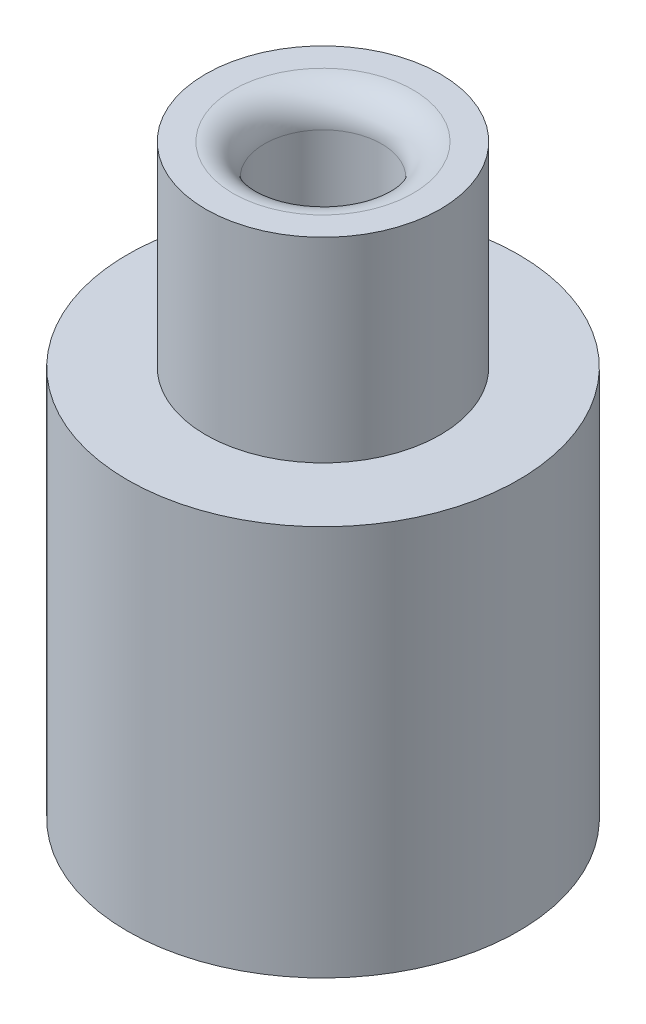
ISO-10303-21;
HEADER;
FILE_DESCRIPTION(('STEP AP214'),'2;1');
FILE_NAME('part.step','',(''),(''),'','','');
FILE_SCHEMA(('AUTOMOTIVE_DESIGN { 1 0 10303 214 1 1 1 1 }'));
ENDSEC;
DATA;
#1=APPLICATION_CONTEXT('core data for automotive mechanical design processes');
#2=APPLICATION_PROTOCOL_DEFINITION('international standard','automotive_design',2000,#1);
#3=PRODUCT_CONTEXT('',#1,'mechanical');
#4=PRODUCT('Part','Part','',(#3));
#5=PRODUCT_RELATED_PRODUCT_CATEGORY('part','',(#4));
#6=PRODUCT_DEFINITION_FORMATION('','',#4);
#7=PRODUCT_DEFINITION_CONTEXT('part definition',#1,'design');
#8=PRODUCT_DEFINITION('design','',#6,#7);
#9=PRODUCT_DEFINITION_SHAPE('','',#8);
#10=(LENGTH_UNIT() NAMED_UNIT(*) SI_UNIT(.MILLI.,.METRE.));
#11=(NAMED_UNIT(*) PLANE_ANGLE_UNIT() SI_UNIT($,.RADIAN.));
#12=(NAMED_UNIT(*) SI_UNIT($,.STERADIAN.) SOLID_ANGLE_UNIT());
#13=UNCERTAINTY_MEASURE_WITH_UNIT(LENGTH_MEASURE(1.E-05),#10,'distance_accuracy_value','');
#14=(GEOMETRIC_REPRESENTATION_CONTEXT(3) GLOBAL_UNCERTAINTY_ASSIGNED_CONTEXT((#13)) GLOBAL_UNIT_ASSIGNED_CONTEXT((#10,
#11,#12)) REPRESENTATION_CONTEXT('',''));
#15=CARTESIAN_POINT('',(0.,0.,0.));
#16=DIRECTION('',(0.,0.,1.));
#17=DIRECTION('',(1.,0.,0.));
#18=AXIS2_PLACEMENT_3D('',#15,#16,#17);
#19=CARTESIAN_POINT('',(0.,-4.,0.));
#20=DIRECTION('',(0.,1.,0.));
#21=DIRECTION('',(0.,0.,1.));
#22=AXIS2_PLACEMENT_3D('',#19,#20,#21);
#23=CYLINDRICAL_SURFACE('',#22,5.);
#24=CARTESIAN_POINT('',(0.,-4.,0.));
#25=DIRECTION('',(0.,1.,0.));
#26=DIRECTION('',(0.,0.,1.));
#27=AXIS2_PLACEMENT_3D('',#24,#25,#26);
#28=CIRCLE('',#27,5.);
#29=CARTESIAN_POINT('',(0.,-4.,5.));
#30=VERTEX_POINT('',#29);
#31=EDGE_CURVE('E46',#30,#30,#28,.T.);
#32=ORIENTED_EDGE('',*,*,#31,.T.);
#33=EDGE_LOOP('',(#32));
#34=FACE_BOUND('',#33,.T.);
#35=CARTESIAN_POINT('',(0.,6.,0.));
#36=DIRECTION('',(0.,1.,0.));
#37=DIRECTION('',(0.,0.,1.));
#38=AXIS2_PLACEMENT_3D('',#35,#36,#37);
#39=CIRCLE('',#38,5.);
#40=CARTESIAN_POINT('',(0.,6.,5.));
#41=VERTEX_POINT('',#40);
#42=EDGE_CURVE('E51',#41,#41,#39,.T.);
#43=ORIENTED_EDGE('',*,*,#42,.F.);
#44=EDGE_LOOP('',(#43));
#45=FACE_BOUND('',#44,.T.);
#46=ADVANCED_FACE('F31',(#34,#45),#23,.T.);
#47=CARTESIAN_POINT('',(0.,-4.,0.));
#48=DIRECTION('',(0.,1.,0.));
#49=DIRECTION('',(0.,0.,1.));
#50=AXIS2_PLACEMENT_3D('',#47,#48,#49);
#51=PLANE('',#50);
#52=CARTESIAN_POINT('',(0.,-4.,0.));
#53=DIRECTION('',(0.,-1.,0.));
#54=DIRECTION('',(0.,0.,-1.));
#55=AXIS2_PLACEMENT_3D('',#52,#53,#54);
#56=CIRCLE('',#55,2.5);
#57=CARTESIAN_POINT('',(0.,-4.,-2.5));
#58=VERTEX_POINT('',#57);
#59=EDGE_CURVE('E61',#58,#58,#56,.T.);
#60=ORIENTED_EDGE('',*,*,#59,.F.);
#61=EDGE_LOOP('',(#60));
#62=FACE_BOUND('',#61,.T.);
#63=ORIENTED_EDGE('',*,*,#31,.F.);
#64=EDGE_LOOP('',(#63));
#65=FACE_BOUND('',#64,.T.);
#66=ADVANCED_FACE('F76',(#62,#65),#51,.F.);
#67=CARTESIAN_POINT('',(0.,6.,0.));
#68=DIRECTION('',(0.,1.,0.));
#69=DIRECTION('',(0.,0.,1.));
#70=AXIS2_PLACEMENT_3D('',#67,#68,#69);
#71=PLANE('',#70);
#72=CARTESIAN_POINT('',(0.,6.,0.));
#73=DIRECTION('',(0.,1.,0.));
#74=DIRECTION('',(0.,0.,1.));
#75=AXIS2_PLACEMENT_3D('',#72,#73,#74);
#76=CIRCLE('',#75,3.);
#77=CARTESIAN_POINT('',(0.,6.,3.));
#78=VERTEX_POINT('',#77);
#79=EDGE_CURVE('E42',#78,#78,#76,.T.);
#80=ORIENTED_EDGE('',*,*,#79,.F.);
#81=EDGE_LOOP('',(#80));
#82=FACE_BOUND('',#81,.T.);
#83=ORIENTED_EDGE('',*,*,#42,.T.);
#84=EDGE_LOOP('',(#83));
#85=FACE_BOUND('',#84,.T.);
#86=ADVANCED_FACE('F79',(#82,#85),#71,.T.);
#87=CARTESIAN_POINT('',(0.,5.,0.));
#88=DIRECTION('',(0.,1.,0.));
#89=DIRECTION('',(0.,0.,1.));
#90=AXIS2_PLACEMENT_3D('',#87,#88,#89);
#91=CYLINDRICAL_SURFACE('',#90,3.);
#92=ORIENTED_EDGE('',*,*,#79,.T.);
#93=EDGE_LOOP('',(#92));
#94=FACE_BOUND('',#93,.T.);
#95=CARTESIAN_POINT('',(0.,11.,0.));
#96=DIRECTION('',(0.,1.,0.));
#97=DIRECTION('',(0.,0.,1.));
#98=AXIS2_PLACEMENT_3D('',#95,#96,#97);
#99=CIRCLE('',#98,3.);
#100=CARTESIAN_POINT('',(0.,11.,3.));
#101=VERTEX_POINT('',#100);
#102=EDGE_CURVE('E54',#101,#101,#99,.T.);
#103=ORIENTED_EDGE('',*,*,#102,.F.);
#104=EDGE_LOOP('',(#103));
#105=FACE_BOUND('',#104,.T.);
#106=ADVANCED_FACE('F88',(#94,#105),#91,.T.);
#107=CARTESIAN_POINT('',(0.,11.,0.));
#108=DIRECTION('',(0.,1.,0.));
#109=DIRECTION('',(0.,0.,1.));
#110=AXIS2_PLACEMENT_3D('',#107,#108,#109);
#111=PLANE('',#110);
#112=CARTESIAN_POINT('',(0.,11.,0.));
#113=DIRECTION('',(0.,1.,0.));
#114=DIRECTION('',(0.,0.,1.));
#115=AXIS2_PLACEMENT_3D('',#112,#113,#114);
#116=CIRCLE('',#115,2.3);
#117=CARTESIAN_POINT('',(0.,11.,2.3));
#118=VERTEX_POINT('',#117);
#119=EDGE_CURVE('E10',#118,#118,#116,.F.);
#120=ORIENTED_EDGE('',*,*,#119,.T.);
#121=EDGE_LOOP('',(#120));
#122=FACE_BOUND('',#121,.T.);
#123=ORIENTED_EDGE('',*,*,#102,.T.);
#124=EDGE_LOOP('',(#123));
#125=FACE_BOUND('',#124,.T.);
#126=ADVANCED_FACE('F94',(#122,#125),#111,.T.);
#127=CARTESIAN_POINT('',(0.,5.,0.));
#128=DIRECTION('',(0.,1.,0.));
#129=DIRECTION('',(0.,0.,1.));
#130=AXIS2_PLACEMENT_3D('',#127,#128,#129);
#131=CYLINDRICAL_SURFACE('',#130,1.5);
#132=CARTESIAN_POINT('',(0.,10.2,0.));
#133=DIRECTION('',(0.,1.,0.));
#134=DIRECTION('',(0.,0.,1.));
#135=AXIS2_PLACEMENT_3D('',#132,#133,#134);
#136=CIRCLE('',#135,1.5);
#137=CARTESIAN_POINT('',(0.,10.2,1.5));
#138=VERTEX_POINT('',#137);
#139=EDGE_CURVE('E38',#138,#138,#136,.T.);
#140=ORIENTED_EDGE('',*,*,#139,.T.);
#141=EDGE_LOOP('',(#140));
#142=FACE_BOUND('',#141,.T.);
#143=CARTESIAN_POINT('',(0.,5.,0.));
#144=DIRECTION('',(0.,1.,0.));
#145=DIRECTION('',(0.,0.,1.));
#146=AXIS2_PLACEMENT_3D('',#143,#144,#145);
#147=CIRCLE('',#146,1.5);
#148=CARTESIAN_POINT('',(0.,5.,1.5));
#149=VERTEX_POINT('',#148);
#150=EDGE_CURVE('E57',#149,#149,#147,.T.);
#151=ORIENTED_EDGE('',*,*,#150,.F.);
#152=EDGE_LOOP('',(#151));
#153=FACE_BOUND('',#152,.T.);
#154=ADVANCED_FACE('F101',(#142,#153),#131,.F.);
#155=CARTESIAN_POINT('',(0.,5.,0.));
#156=DIRECTION('',(0.,1.,0.));
#157=DIRECTION('',(0.,0.,1.));
#158=AXIS2_PLACEMENT_3D('',#155,#156,#157);
#159=PLANE('',#158);
#160=ORIENTED_EDGE('',*,*,#150,.T.);
#161=EDGE_LOOP('',(#160));
#162=FACE_BOUND('',#161,.T.);
#163=ADVANCED_FACE('F72',(#162),#159,.T.);
#164=CARTESIAN_POINT('',(0.,1.,0.));
#165=DIRECTION('',(0.,-1.,0.));
#166=DIRECTION('',(0.,0.,-1.));
#167=AXIS2_PLACEMENT_3D('',#164,#165,#166);
#168=CYLINDRICAL_SURFACE('',#167,2.5);
#169=CARTESIAN_POINT('',(0.,1.,0.));
#170=DIRECTION('',(0.,-1.,0.));
#171=DIRECTION('',(0.,0.,-1.));
#172=AXIS2_PLACEMENT_3D('',#169,#170,#171);
#173=CIRCLE('',#172,2.5);
#174=CARTESIAN_POINT('',(0.,1.,-2.5));
#175=VERTEX_POINT('',#174);
#176=EDGE_CURVE('E60',#175,#175,#173,.T.);
#177=ORIENTED_EDGE('',*,*,#176,.F.);
#178=EDGE_LOOP('',(#177));
#179=FACE_BOUND('',#178,.T.);
#180=ORIENTED_EDGE('',*,*,#59,.T.);
#181=EDGE_LOOP('',(#180));
#182=FACE_BOUND('',#181,.T.);
#183=ADVANCED_FACE('F69',(#179,#182),#168,.F.);
#184=CARTESIAN_POINT('',(0.,1.,0.));
#185=DIRECTION('',(0.,-1.,0.));
#186=DIRECTION('',(0.,0.,-1.));
#187=AXIS2_PLACEMENT_3D('',#184,#185,#186);
#188=PLANE('',#187);
#189=ORIENTED_EDGE('',*,*,#176,.T.);
#190=EDGE_LOOP('',(#189));
#191=FACE_BOUND('',#190,.T.);
#192=ADVANCED_FACE('F67',(#191),#188,.T.);
#193=CARTESIAN_POINT('',(0.,10.2,0.));
#194=DIRECTION('',(0.,1.,0.));
#195=DIRECTION('',(0.,0.,1.));
#196=AXIS2_PLACEMENT_3D('',#193,#194,#195);
#197=TOROIDAL_SURFACE('',#196,2.3,0.8);
#198=ORIENTED_EDGE('',*,*,#119,.F.);
#199=EDGE_LOOP('',(#198));
#200=FACE_BOUND('',#199,.T.);
#201=ORIENTED_EDGE('',*,*,#139,.F.);
#202=EDGE_LOOP('',(#201));
#203=FACE_BOUND('',#202,.T.);
#204=ADVANCED_FACE('F33',(#200,#203),#197,.T.);
#205=CLOSED_SHELL('',(#46,#66,#86,#106,#126,#154,#163,#183,#192,#204));
#206=MANIFOLD_SOLID_BREP('B2',#205);
#207=ADVANCED_BREP_SHAPE_REPRESENTATION('',(#18,#206),#14);
#208=SHAPE_DEFINITION_REPRESENTATION(#9,#207);
ENDSEC;
END-ISO-10303-21;
